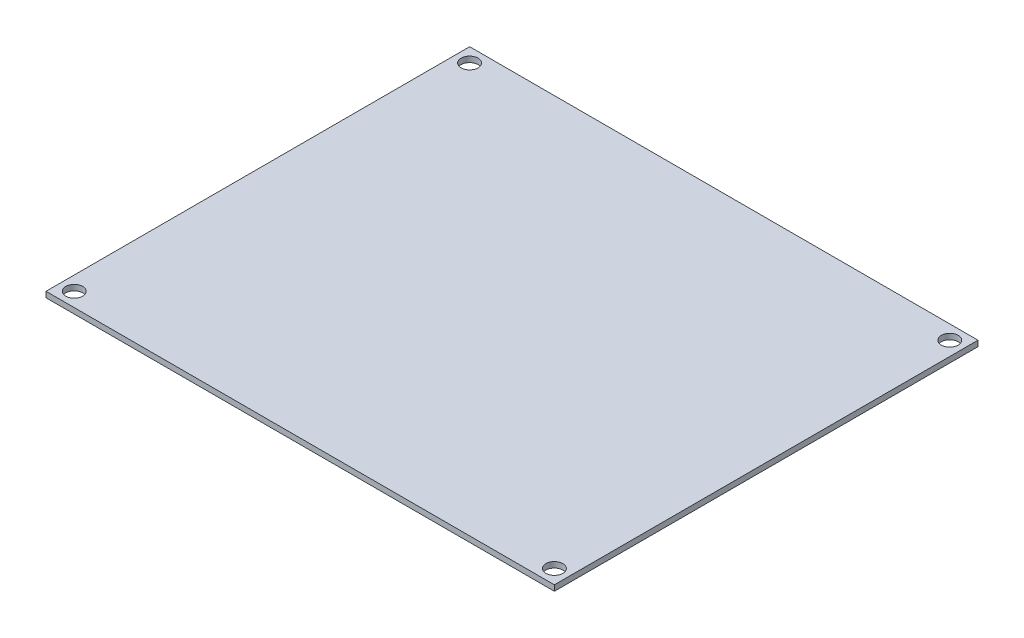
ISO-10303-21;
HEADER;
FILE_DESCRIPTION(('STEP AP214'),'2;1');
FILE_NAME('part.step','',(''),(''),'','','');
FILE_SCHEMA(('AUTOMOTIVE_DESIGN { 1 0 10303 214 1 1 1 1 }'));
ENDSEC;
DATA;
#1=APPLICATION_CONTEXT('core data for automotive mechanical design processes');
#2=APPLICATION_PROTOCOL_DEFINITION('international standard','automotive_design',2000,#1);
#3=PRODUCT_CONTEXT('',#1,'mechanical');
#4=PRODUCT('Part','Part','',(#3));
#5=PRODUCT_RELATED_PRODUCT_CATEGORY('part','',(#4));
#6=PRODUCT_DEFINITION_FORMATION('','',#4);
#7=PRODUCT_DEFINITION_CONTEXT('part definition',#1,'design');
#8=PRODUCT_DEFINITION('design','',#6,#7);
#9=PRODUCT_DEFINITION_SHAPE('','',#8);
#10=(LENGTH_UNIT() NAMED_UNIT(*) SI_UNIT(.MILLI.,.METRE.));
#11=(NAMED_UNIT(*) PLANE_ANGLE_UNIT() SI_UNIT($,.RADIAN.));
#12=(NAMED_UNIT(*) SI_UNIT($,.STERADIAN.) SOLID_ANGLE_UNIT());
#13=UNCERTAINTY_MEASURE_WITH_UNIT(LENGTH_MEASURE(1.E-05),#10,'distance_accuracy_value','');
#14=(GEOMETRIC_REPRESENTATION_CONTEXT(3) GLOBAL_UNCERTAINTY_ASSIGNED_CONTEXT((#13)) GLOBAL_UNIT_ASSIGNED_CONTEXT((#10,
#11,#12)) REPRESENTATION_CONTEXT('',''));
#15=CARTESIAN_POINT('',(0.,0.,0.));
#16=DIRECTION('',(0.,0.,1.));
#17=DIRECTION('',(1.,0.,0.));
#18=AXIS2_PLACEMENT_3D('',#15,#16,#17);
#19=CARTESIAN_POINT('',(0.,2.,0.));
#20=DIRECTION('',(0.,-1.,0.));
#21=DIRECTION('',(0.,0.,-1.));
#22=AXIS2_PLACEMENT_3D('',#19,#20,#21);
#23=PLANE('',#22);
#24=DIRECTION('',(1.,0.,0.));
#25=VECTOR('',#24,1.);
#26=CARTESIAN_POINT('',(-90.,2.,85.));
#27=LINE('',#26,#25);
#28=CARTESIAN_POINT('',(-90.,2.,85.));
#29=VERTEX_POINT('',#28);
#30=CARTESIAN_POINT('',(90.,2.,85.));
#31=VERTEX_POINT('',#30);
#32=EDGE_CURVE('E87',#29,#31,#27,.T.);
#33=ORIENTED_EDGE('',*,*,#32,.T.);
#34=DIRECTION('',(0.,0.,-1.));
#35=VECTOR('',#34,1.);
#36=CARTESIAN_POINT('',(90.,2.,-65.));
#37=LINE('',#36,#35);
#38=CARTESIAN_POINT('',(90.,2.,-65.));
#39=VERTEX_POINT('',#38);
#40=EDGE_CURVE('E82',#31,#39,#37,.T.);
#41=ORIENTED_EDGE('',*,*,#40,.T.);
#42=DIRECTION('',(-1.,0.,0.));
#43=VECTOR('',#42,1.);
#44=CARTESIAN_POINT('',(-90.,2.,-65.));
#45=LINE('',#44,#43);
#46=CARTESIAN_POINT('',(-90.,2.,-65.));
#47=VERTEX_POINT('',#46);
#48=EDGE_CURVE('E85',#39,#47,#45,.T.);
#49=ORIENTED_EDGE('',*,*,#48,.T.);
#50=DIRECTION('',(0.,0.,1.));
#51=VECTOR('',#50,1.);
#52=CARTESIAN_POINT('',(-90.,2.,-65.));
#53=LINE('',#52,#51);
#54=EDGE_CURVE('E52',#47,#29,#53,.T.);
#55=ORIENTED_EDGE('',*,*,#54,.T.);
#56=EDGE_LOOP('',(#33,#41,#49,#55));
#57=FACE_BOUND('',#56,.T.);
#58=CARTESIAN_POINT('',(85.,2.,80.));
#59=DIRECTION('',(0.,1.,0.));
#60=DIRECTION('',(0.,0.,-1.));
#61=AXIS2_PLACEMENT_3D('',#58,#59,#60);
#62=CIRCLE('',#61,2.99999999999999);
#63=CARTESIAN_POINT('',(85.,2.,77.));
#64=VERTEX_POINT('',#63);
#65=EDGE_CURVE('E102',#64,#64,#62,.T.);
#66=ORIENTED_EDGE('',*,*,#65,.F.);
#67=EDGE_LOOP('',(#66));
#68=FACE_BOUND('',#67,.T.);
#69=CARTESIAN_POINT('',(-85.0000000000005,2.,-60.));
#70=DIRECTION('',(0.,1.,0.));
#71=DIRECTION('',(0.,0.,1.));
#72=AXIS2_PLACEMENT_3D('',#69,#70,#71);
#73=CIRCLE('',#72,3.00000000000002);
#74=CARTESIAN_POINT('',(-85.0000000000005,2.,-57.));
#75=VERTEX_POINT('',#74);
#76=EDGE_CURVE('E117',#75,#75,#73,.T.);
#77=ORIENTED_EDGE('',*,*,#76,.F.);
#78=EDGE_LOOP('',(#77));
#79=FACE_BOUND('',#78,.T.);
#80=CARTESIAN_POINT('',(-85.,2.,80.));
#81=DIRECTION('',(0.,1.,0.));
#82=DIRECTION('',(0.,0.,1.));
#83=AXIS2_PLACEMENT_3D('',#80,#81,#82);
#84=CIRCLE('',#83,3.00000000000002);
#85=CARTESIAN_POINT('',(-85.,2.,83.));
#86=VERTEX_POINT('',#85);
#87=EDGE_CURVE('E123',#86,#86,#84,.T.);
#88=ORIENTED_EDGE('',*,*,#87,.F.);
#89=EDGE_LOOP('',(#88));
#90=FACE_BOUND('',#89,.T.);
#91=CARTESIAN_POINT('',(84.9999999999995,2.,-60.));
#92=DIRECTION('',(0.,1.,0.));
#93=DIRECTION('',(0.,0.,-1.));
#94=AXIS2_PLACEMENT_3D('',#91,#92,#93);
#95=CIRCLE('',#94,3.00000000000002);
#96=CARTESIAN_POINT('',(84.9999999999995,2.,-63.));
#97=VERTEX_POINT('',#96);
#98=EDGE_CURVE('E129',#97,#97,#95,.T.);
#99=ORIENTED_EDGE('',*,*,#98,.F.);
#100=EDGE_LOOP('',(#99));
#101=FACE_BOUND('',#100,.T.);
#102=ADVANCED_FACE('F35',(#57,#68,#79,#90,#101),#23,.F.);
#103=CARTESIAN_POINT('',(0.,0.,0.));
#104=DIRECTION('',(0.,-1.,0.));
#105=DIRECTION('',(0.,0.,-1.));
#106=AXIS2_PLACEMENT_3D('',#103,#104,#105);
#107=PLANE('',#106);
#108=CARTESIAN_POINT('',(-85.,0.,80.));
#109=DIRECTION('',(0.,1.,0.));
#110=DIRECTION('',(0.,0.,1.));
#111=AXIS2_PLACEMENT_3D('',#108,#109,#110);
#112=CIRCLE('',#111,3.00000000000002);
#113=CARTESIAN_POINT('',(-85.,0.,83.));
#114=VERTEX_POINT('',#113);
#115=EDGE_CURVE('E126',#114,#114,#112,.T.);
#116=ORIENTED_EDGE('',*,*,#115,.T.);
#117=EDGE_LOOP('',(#116));
#118=FACE_BOUND('',#117,.T.);
#119=CARTESIAN_POINT('',(85.,0.,80.));
#120=DIRECTION('',(0.,1.,0.));
#121=DIRECTION('',(0.,0.,-1.));
#122=AXIS2_PLACEMENT_3D('',#119,#120,#121);
#123=CIRCLE('',#122,2.99999999999999);
#124=CARTESIAN_POINT('',(85.,0.,77.));
#125=VERTEX_POINT('',#124);
#126=EDGE_CURVE('E114',#125,#125,#123,.T.);
#127=ORIENTED_EDGE('',*,*,#126,.T.);
#128=EDGE_LOOP('',(#127));
#129=FACE_BOUND('',#128,.T.);
#130=DIRECTION('',(1.,0.,0.));
#131=VECTOR('',#130,1.);
#132=CARTESIAN_POINT('',(-90.,0.,85.));
#133=LINE('',#132,#131);
#134=CARTESIAN_POINT('',(-90.,0.,85.));
#135=VERTEX_POINT('',#134);
#136=CARTESIAN_POINT('',(90.,0.,85.));
#137=VERTEX_POINT('',#136);
#138=EDGE_CURVE('E99',#135,#137,#133,.T.);
#139=ORIENTED_EDGE('',*,*,#138,.F.);
#140=DIRECTION('',(0.,0.,1.));
#141=VECTOR('',#140,1.);
#142=CARTESIAN_POINT('',(-90.,0.,-65.));
#143=LINE('',#142,#141);
#144=CARTESIAN_POINT('',(-90.,0.,-65.));
#145=VERTEX_POINT('',#144);
#146=EDGE_CURVE('E75',#145,#135,#143,.T.);
#147=ORIENTED_EDGE('',*,*,#146,.F.);
#148=DIRECTION('',(-1.,0.,0.));
#149=VECTOR('',#148,1.);
#150=CARTESIAN_POINT('',(-90.,0.,-65.));
#151=LINE('',#150,#149);
#152=CARTESIAN_POINT('',(90.,0.,-65.));
#153=VERTEX_POINT('',#152);
#154=EDGE_CURVE('E69',#153,#145,#151,.T.);
#155=ORIENTED_EDGE('',*,*,#154,.F.);
#156=DIRECTION('',(0.,0.,-1.));
#157=VECTOR('',#156,1.);
#158=CARTESIAN_POINT('',(90.,0.,-65.));
#159=LINE('',#158,#157);
#160=EDGE_CURVE('E91',#137,#153,#159,.T.);
#161=ORIENTED_EDGE('',*,*,#160,.F.);
#162=EDGE_LOOP('',(#139,#147,#155,#161));
#163=FACE_BOUND('',#162,.T.);
#164=CARTESIAN_POINT('',(-85.0000000000005,0.,-60.));
#165=DIRECTION('',(0.,1.,0.));
#166=DIRECTION('',(0.,0.,1.));
#167=AXIS2_PLACEMENT_3D('',#164,#165,#166);
#168=CIRCLE('',#167,3.00000000000002);
#169=CARTESIAN_POINT('',(-85.0000000000005,0.,-57.));
#170=VERTEX_POINT('',#169);
#171=EDGE_CURVE('E120',#170,#170,#168,.T.);
#172=ORIENTED_EDGE('',*,*,#171,.T.);
#173=EDGE_LOOP('',(#172));
#174=FACE_BOUND('',#173,.T.);
#175=CARTESIAN_POINT('',(84.9999999999995,0.,-60.));
#176=DIRECTION('',(0.,1.,0.));
#177=DIRECTION('',(0.,0.,-1.));
#178=AXIS2_PLACEMENT_3D('',#175,#176,#177);
#179=CIRCLE('',#178,3.00000000000002);
#180=CARTESIAN_POINT('',(84.9999999999995,0.,-63.));
#181=VERTEX_POINT('',#180);
#182=EDGE_CURVE('E132',#181,#181,#179,.T.);
#183=ORIENTED_EDGE('',*,*,#182,.T.);
#184=EDGE_LOOP('',(#183));
#185=FACE_BOUND('',#184,.T.);
#186=ADVANCED_FACE('F110',(#118,#129,#163,#174,#185),#107,.T.);
#187=CARTESIAN_POINT('',(-90.,2.,85.));
#188=DIRECTION('',(0.,0.,-1.));
#189=DIRECTION('',(-1.,0.,0.));
#190=AXIS2_PLACEMENT_3D('',#187,#188,#189);
#191=PLANE('',#190);
#192=ORIENTED_EDGE('',*,*,#138,.T.);
#193=DIRECTION('',(0.,-1.,0.));
#194=VECTOR('',#193,1.);
#195=CARTESIAN_POINT('',(90.,2.,85.));
#196=LINE('',#195,#194);
#197=EDGE_CURVE('E11',#31,#137,#196,.T.);
#198=ORIENTED_EDGE('',*,*,#197,.F.);
#199=ORIENTED_EDGE('',*,*,#32,.F.);
#200=DIRECTION('',(0.,-1.,0.));
#201=VECTOR('',#200,1.);
#202=CARTESIAN_POINT('',(-90.,2.,85.));
#203=LINE('',#202,#201);
#204=EDGE_CURVE('E95',#29,#135,#203,.T.);
#205=ORIENTED_EDGE('',*,*,#204,.T.);
#206=EDGE_LOOP('',(#192,#198,#199,#205));
#207=FACE_BOUND('',#206,.T.);
#208=ADVANCED_FACE('F37',(#207),#191,.F.);
#209=CARTESIAN_POINT('',(90.,2.,-65.));
#210=DIRECTION('',(-1.,0.,0.));
#211=DIRECTION('',(0.,0.,1.));
#212=AXIS2_PLACEMENT_3D('',#209,#210,#211);
#213=PLANE('',#212);
#214=ORIENTED_EDGE('',*,*,#160,.T.);
#215=DIRECTION('',(0.,-1.,0.));
#216=VECTOR('',#215,1.);
#217=CARTESIAN_POINT('',(90.,2.,-65.));
#218=LINE('',#217,#216);
#219=EDGE_CURVE('E44',#39,#153,#218,.T.);
#220=ORIENTED_EDGE('',*,*,#219,.F.);
#221=ORIENTED_EDGE('',*,*,#40,.F.);
#222=ORIENTED_EDGE('',*,*,#197,.T.);
#223=EDGE_LOOP('',(#214,#220,#221,#222));
#224=FACE_BOUND('',#223,.T.);
#225=ADVANCED_FACE('F90',(#224),#213,.F.);
#226=CARTESIAN_POINT('',(-90.,2.,-65.));
#227=DIRECTION('',(0.,0.,1.));
#228=DIRECTION('',(1.,0.,0.));
#229=AXIS2_PLACEMENT_3D('',#226,#227,#228);
#230=PLANE('',#229);
#231=ORIENTED_EDGE('',*,*,#154,.T.);
#232=DIRECTION('',(0.,-1.,0.));
#233=VECTOR('',#232,1.);
#234=CARTESIAN_POINT('',(-90.,2.,-65.));
#235=LINE('',#234,#233);
#236=EDGE_CURVE('E92',#47,#145,#235,.T.);
#237=ORIENTED_EDGE('',*,*,#236,.F.);
#238=ORIENTED_EDGE('',*,*,#48,.F.);
#239=ORIENTED_EDGE('',*,*,#219,.T.);
#240=EDGE_LOOP('',(#231,#237,#238,#239));
#241=FACE_BOUND('',#240,.T.);
#242=ADVANCED_FACE('F93',(#241),#230,.F.);
#243=CARTESIAN_POINT('',(-90.,2.,-65.));
#244=DIRECTION('',(1.,0.,0.));
#245=DIRECTION('',(0.,0.,-1.));
#246=AXIS2_PLACEMENT_3D('',#243,#244,#245);
#247=PLANE('',#246);
#248=ORIENTED_EDGE('',*,*,#146,.T.);
#249=ORIENTED_EDGE('',*,*,#204,.F.);
#250=ORIENTED_EDGE('',*,*,#54,.F.);
#251=ORIENTED_EDGE('',*,*,#236,.T.);
#252=EDGE_LOOP('',(#248,#249,#250,#251));
#253=FACE_BOUND('',#252,.T.);
#254=ADVANCED_FACE('F107',(#253),#247,.F.);
#255=CARTESIAN_POINT('',(85.,2.,80.));
#256=DIRECTION('',(0.,-1.,0.));
#257=DIRECTION('',(0.,0.,-1.));
#258=AXIS2_PLACEMENT_3D('',#255,#256,#257);
#259=CYLINDRICAL_SURFACE('',#258,2.99999999999999);
#260=ORIENTED_EDGE('',*,*,#65,.T.);
#261=EDGE_LOOP('',(#260));
#262=FACE_BOUND('',#261,.T.);
#263=ORIENTED_EDGE('',*,*,#126,.F.);
#264=EDGE_LOOP('',(#263));
#265=FACE_BOUND('',#264,.T.);
#266=ADVANCED_FACE('F149',(#262,#265),#259,.F.);
#267=CARTESIAN_POINT('',(-85.0000000000005,2.,-60.));
#268=DIRECTION('',(0.,-1.,0.));
#269=DIRECTION('',(0.,0.,-1.));
#270=AXIS2_PLACEMENT_3D('',#267,#268,#269);
#271=CYLINDRICAL_SURFACE('',#270,3.00000000000002);
#272=ORIENTED_EDGE('',*,*,#76,.T.);
#273=EDGE_LOOP('',(#272));
#274=FACE_BOUND('',#273,.T.);
#275=ORIENTED_EDGE('',*,*,#171,.F.);
#276=EDGE_LOOP('',(#275));
#277=FACE_BOUND('',#276,.T.);
#278=ADVANCED_FACE('F195',(#274,#277),#271,.F.);
#279=CARTESIAN_POINT('',(-85.,2.,80.));
#280=DIRECTION('',(0.,-1.,0.));
#281=DIRECTION('',(0.,0.,-1.));
#282=AXIS2_PLACEMENT_3D('',#279,#280,#281);
#283=CYLINDRICAL_SURFACE('',#282,3.00000000000002);
#284=ORIENTED_EDGE('',*,*,#87,.T.);
#285=EDGE_LOOP('',(#284));
#286=FACE_BOUND('',#285,.T.);
#287=ORIENTED_EDGE('',*,*,#115,.F.);
#288=EDGE_LOOP('',(#287));
#289=FACE_BOUND('',#288,.T.);
#290=ADVANCED_FACE('F203',(#286,#289),#283,.F.);
#291=CARTESIAN_POINT('',(84.9999999999995,2.,-60.));
#292=DIRECTION('',(0.,-1.,0.));
#293=DIRECTION('',(0.,0.,-1.));
#294=AXIS2_PLACEMENT_3D('',#291,#292,#293);
#295=CYLINDRICAL_SURFACE('',#294,3.00000000000002);
#296=ORIENTED_EDGE('',*,*,#98,.T.);
#297=EDGE_LOOP('',(#296));
#298=FACE_BOUND('',#297,.T.);
#299=ORIENTED_EDGE('',*,*,#182,.F.);
#300=EDGE_LOOP('',(#299));
#301=FACE_BOUND('',#300,.T.);
#302=ADVANCED_FACE('F138',(#298,#301),#295,.F.);
#303=CLOSED_SHELL('',(#102,#186,#208,#225,#242,#254,#266,#278,#290,#302));
#304=MANIFOLD_SOLID_BREP('B2',#303);
#305=ADVANCED_BREP_SHAPE_REPRESENTATION('',(#18,#304),#14);
#306=SHAPE_DEFINITION_REPRESENTATION(#9,#305);
ENDSEC;
END-ISO-10303-21;
